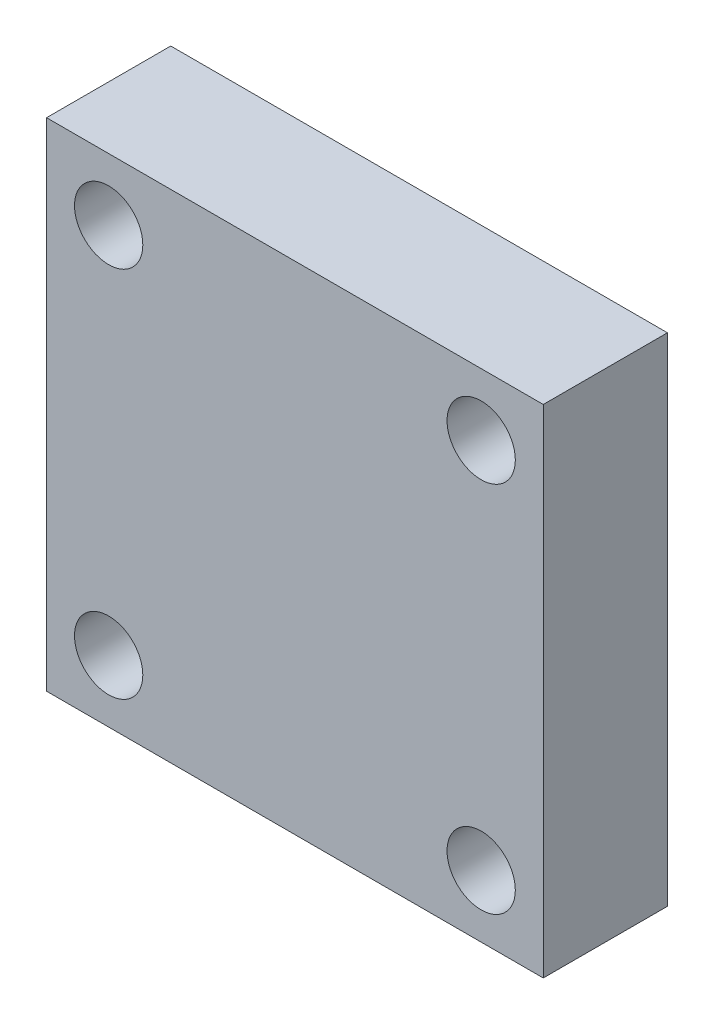
ISO-10303-21;
HEADER;
FILE_DESCRIPTION(('STEP AP214'),'2;1');
FILE_NAME('part.step','',(''),(''),'','','');
FILE_SCHEMA(('AUTOMOTIVE_DESIGN { 1 0 10303 214 1 1 1 1 }'));
ENDSEC;
DATA;
#1=APPLICATION_CONTEXT('core data for automotive mechanical design processes');
#2=APPLICATION_PROTOCOL_DEFINITION('international standard','automotive_design',2000,#1);
#3=PRODUCT_CONTEXT('',#1,'mechanical');
#4=PRODUCT('Part','Part','',(#3));
#5=PRODUCT_RELATED_PRODUCT_CATEGORY('part','',(#4));
#6=PRODUCT_DEFINITION_FORMATION('','',#4);
#7=PRODUCT_DEFINITION_CONTEXT('part definition',#1,'design');
#8=PRODUCT_DEFINITION('design','',#6,#7);
#9=PRODUCT_DEFINITION_SHAPE('','',#8);
#10=(LENGTH_UNIT() NAMED_UNIT(*) SI_UNIT(.MILLI.,.METRE.));
#11=(NAMED_UNIT(*) PLANE_ANGLE_UNIT() SI_UNIT($,.RADIAN.));
#12=(NAMED_UNIT(*) SI_UNIT($,.STERADIAN.) SOLID_ANGLE_UNIT());
#13=UNCERTAINTY_MEASURE_WITH_UNIT(LENGTH_MEASURE(1.E-05),#10,'distance_accuracy_value','');
#14=(GEOMETRIC_REPRESENTATION_CONTEXT(3) GLOBAL_UNCERTAINTY_ASSIGNED_CONTEXT((#13)) GLOBAL_UNIT_ASSIGNED_CONTEXT((#10,
#11,#12)) REPRESENTATION_CONTEXT('',''));
#15=CARTESIAN_POINT('',(0.,0.,0.));
#16=DIRECTION('',(0.,0.,1.));
#17=DIRECTION('',(1.,0.,0.));
#18=AXIS2_PLACEMENT_3D('',#15,#16,#17);
#19=CARTESIAN_POINT('',(0.,0.,10.));
#20=DIRECTION('',(0.,0.,-1.));
#21=DIRECTION('',(-1.,0.,0.));
#22=AXIS2_PLACEMENT_3D('',#19,#20,#21);
#23=PLANE('',#22);
#24=DIRECTION('',(0.,1.,0.));
#25=VECTOR('',#24,1.);
#26=CARTESIAN_POINT('',(20.,-20.,10.));
#27=LINE('',#26,#25);
#28=CARTESIAN_POINT('',(20.,-20.,10.));
#29=VERTEX_POINT('',#28);
#30=CARTESIAN_POINT('',(20.,20.,10.));
#31=VERTEX_POINT('',#30);
#32=EDGE_CURVE('E98',#29,#31,#27,.T.);
#33=ORIENTED_EDGE('',*,*,#32,.T.);
#34=DIRECTION('',(-1.,0.,0.));
#35=VECTOR('',#34,1.);
#36=CARTESIAN_POINT('',(-20.,20.,10.));
#37=LINE('',#36,#35);
#38=CARTESIAN_POINT('',(-20.,20.,10.));
#39=VERTEX_POINT('',#38);
#40=EDGE_CURVE('E93',#31,#39,#37,.T.);
#41=ORIENTED_EDGE('',*,*,#40,.T.);
#42=DIRECTION('',(0.,-1.,0.));
#43=VECTOR('',#42,1.);
#44=CARTESIAN_POINT('',(-20.,-20.,10.));
#45=LINE('',#44,#43);
#46=CARTESIAN_POINT('',(-20.,-20.,10.));
#47=VERTEX_POINT('',#46);
#48=EDGE_CURVE('E96',#39,#47,#45,.T.);
#49=ORIENTED_EDGE('',*,*,#48,.T.);
#50=DIRECTION('',(1.,0.,0.));
#51=VECTOR('',#50,1.);
#52=CARTESIAN_POINT('',(-20.,-20.,10.));
#53=LINE('',#52,#51);
#54=EDGE_CURVE('E63',#47,#29,#53,.T.);
#55=ORIENTED_EDGE('',*,*,#54,.T.);
#56=EDGE_LOOP('',(#33,#41,#49,#55));
#57=FACE_BOUND('',#56,.T.);
#58=CARTESIAN_POINT('',(-15.,-15.,10.));
#59=DIRECTION('',(0.,0.,1.));
#60=DIRECTION('',(1.,0.,0.));
#61=AXIS2_PLACEMENT_3D('',#58,#59,#60);
#62=CIRCLE('',#61,2.75);
#63=CARTESIAN_POINT('',(-12.25,-15.,10.));
#64=VERTEX_POINT('',#63);
#65=EDGE_CURVE('E118',#64,#64,#62,.T.);
#66=ORIENTED_EDGE('',*,*,#65,.F.);
#67=EDGE_LOOP('',(#66));
#68=FACE_BOUND('',#67,.T.);
#69=CARTESIAN_POINT('',(15.,-15.,10.));
#70=DIRECTION('',(0.,0.,1.));
#71=DIRECTION('',(1.,0.,0.));
#72=AXIS2_PLACEMENT_3D('',#69,#70,#71);
#73=CIRCLE('',#72,2.75);
#74=CARTESIAN_POINT('',(17.75,-15.,10.));
#75=VERTEX_POINT('',#74);
#76=EDGE_CURVE('E140',#75,#75,#73,.T.);
#77=ORIENTED_EDGE('',*,*,#76,.F.);
#78=EDGE_LOOP('',(#77));
#79=FACE_BOUND('',#78,.T.);
#80=CARTESIAN_POINT('',(15.,15.,10.));
#81=DIRECTION('',(0.,0.,1.));
#82=DIRECTION('',(1.,0.,0.));
#83=AXIS2_PLACEMENT_3D('',#80,#81,#82);
#84=CIRCLE('',#83,2.75);
#85=CARTESIAN_POINT('',(17.75,15.,10.));
#86=VERTEX_POINT('',#85);
#87=EDGE_CURVE('E148',#86,#86,#84,.T.);
#88=ORIENTED_EDGE('',*,*,#87,.F.);
#89=EDGE_LOOP('',(#88));
#90=FACE_BOUND('',#89,.T.);
#91=CARTESIAN_POINT('',(-15.,15.,10.));
#92=DIRECTION('',(0.,0.,1.));
#93=DIRECTION('',(1.,0.,0.));
#94=AXIS2_PLACEMENT_3D('',#91,#92,#93);
#95=CIRCLE('',#94,2.75);
#96=CARTESIAN_POINT('',(-12.25,15.,10.));
#97=VERTEX_POINT('',#96);
#98=EDGE_CURVE('E156',#97,#97,#95,.T.);
#99=ORIENTED_EDGE('',*,*,#98,.F.);
#100=EDGE_LOOP('',(#99));
#101=FACE_BOUND('',#100,.T.);
#102=ADVANCED_FACE('F45',(#57,#68,#79,#90,#101),#23,.F.);
#103=CARTESIAN_POINT('',(0.,0.,0.));
#104=DIRECTION('',(0.,0.,-1.));
#105=DIRECTION('',(-1.,0.,0.));
#106=AXIS2_PLACEMENT_3D('',#103,#104,#105);
#107=PLANE('',#106);
#108=CARTESIAN_POINT('',(15.,15.,0.));
#109=DIRECTION('',(0.,0.,1.));
#110=DIRECTION('',(1.,0.,0.));
#111=AXIS2_PLACEMENT_3D('',#108,#109,#110);
#112=CIRCLE('',#111,2.75);
#113=CARTESIAN_POINT('',(17.75,15.,0.));
#114=VERTEX_POINT('',#113);
#115=EDGE_CURVE('E152',#114,#114,#112,.T.);
#116=ORIENTED_EDGE('',*,*,#115,.T.);
#117=EDGE_LOOP('',(#116));
#118=FACE_BOUND('',#117,.T.);
#119=CARTESIAN_POINT('',(-15.,-15.,0.));
#120=DIRECTION('',(0.,0.,1.));
#121=DIRECTION('',(1.,0.,0.));
#122=AXIS2_PLACEMENT_3D('',#119,#120,#121);
#123=CIRCLE('',#122,2.75);
#124=CARTESIAN_POINT('',(-12.25,-15.,0.));
#125=VERTEX_POINT('',#124);
#126=EDGE_CURVE('E136',#125,#125,#123,.T.);
#127=ORIENTED_EDGE('',*,*,#126,.T.);
#128=EDGE_LOOP('',(#127));
#129=FACE_BOUND('',#128,.T.);
#130=DIRECTION('',(0.,1.,0.));
#131=VECTOR('',#130,1.);
#132=CARTESIAN_POINT('',(20.,-20.,0.));
#133=LINE('',#132,#131);
#134=CARTESIAN_POINT('',(20.,-20.,0.));
#135=VERTEX_POINT('',#134);
#136=CARTESIAN_POINT('',(20.,20.,0.));
#137=VERTEX_POINT('',#136);
#138=EDGE_CURVE('E114',#135,#137,#133,.T.);
#139=ORIENTED_EDGE('',*,*,#138,.F.);
#140=DIRECTION('',(1.,0.,0.));
#141=VECTOR('',#140,1.);
#142=CARTESIAN_POINT('',(-20.,-20.,0.));
#143=LINE('',#142,#141);
#144=CARTESIAN_POINT('',(-20.,-20.,0.));
#145=VERTEX_POINT('',#144);
#146=EDGE_CURVE('E86',#145,#135,#143,.T.);
#147=ORIENTED_EDGE('',*,*,#146,.F.);
#148=DIRECTION('',(0.,-1.,0.));
#149=VECTOR('',#148,1.);
#150=CARTESIAN_POINT('',(-20.,-20.,0.));
#151=LINE('',#150,#149);
#152=CARTESIAN_POINT('',(-20.,20.,0.));
#153=VERTEX_POINT('',#152);
#154=EDGE_CURVE('E80',#153,#145,#151,.T.);
#155=ORIENTED_EDGE('',*,*,#154,.F.);
#156=DIRECTION('',(-1.,0.,0.));
#157=VECTOR('',#156,1.);
#158=CARTESIAN_POINT('',(-20.,20.,0.));
#159=LINE('',#158,#157);
#160=EDGE_CURVE('E103',#137,#153,#159,.T.);
#161=ORIENTED_EDGE('',*,*,#160,.F.);
#162=EDGE_LOOP('',(#139,#147,#155,#161));
#163=FACE_BOUND('',#162,.T.);
#164=CARTESIAN_POINT('',(15.,-15.,0.));
#165=DIRECTION('',(0.,0.,1.));
#166=DIRECTION('',(1.,0.,0.));
#167=AXIS2_PLACEMENT_3D('',#164,#165,#166);
#168=CIRCLE('',#167,2.75);
#169=CARTESIAN_POINT('',(17.75,-15.,0.));
#170=VERTEX_POINT('',#169);
#171=EDGE_CURVE('E144',#170,#170,#168,.T.);
#172=ORIENTED_EDGE('',*,*,#171,.T.);
#173=EDGE_LOOP('',(#172));
#174=FACE_BOUND('',#173,.T.);
#175=CARTESIAN_POINT('',(-15.,15.,0.));
#176=DIRECTION('',(0.,0.,1.));
#177=DIRECTION('',(1.,0.,0.));
#178=AXIS2_PLACEMENT_3D('',#175,#176,#177);
#179=CIRCLE('',#178,2.75);
#180=CARTESIAN_POINT('',(-12.25,15.,0.));
#181=VERTEX_POINT('',#180);
#182=EDGE_CURVE('E160',#181,#181,#179,.T.);
#183=ORIENTED_EDGE('',*,*,#182,.T.);
#184=EDGE_LOOP('',(#183));
#185=FACE_BOUND('',#184,.T.);
#186=ADVANCED_FACE('F131',(#118,#129,#163,#174,#185),#107,.T.);
#187=CARTESIAN_POINT('',(20.,-20.,10.));
#188=DIRECTION('',(-1.,0.,0.));
#189=DIRECTION('',(0.,0.,1.));
#190=AXIS2_PLACEMENT_3D('',#187,#188,#189);
#191=PLANE('',#190);
#192=ORIENTED_EDGE('',*,*,#138,.T.);
#193=DIRECTION('',(0.,0.,-1.));
#194=VECTOR('',#193,1.);
#195=CARTESIAN_POINT('',(20.,20.,10.));
#196=LINE('',#195,#194);
#197=EDGE_CURVE('E11',#31,#137,#196,.T.);
#198=ORIENTED_EDGE('',*,*,#197,.F.);
#199=ORIENTED_EDGE('',*,*,#32,.F.);
#200=DIRECTION('',(0.,0.,-1.));
#201=VECTOR('',#200,1.);
#202=CARTESIAN_POINT('',(20.,-20.,10.));
#203=LINE('',#202,#201);
#204=EDGE_CURVE('E110',#29,#135,#203,.T.);
#205=ORIENTED_EDGE('',*,*,#204,.T.);
#206=EDGE_LOOP('',(#192,#198,#199,#205));
#207=FACE_BOUND('',#206,.T.);
#208=ADVANCED_FACE('F47',(#207),#191,.F.);
#209=CARTESIAN_POINT('',(-20.,20.,10.));
#210=DIRECTION('',(0.,-1.,0.));
#211=DIRECTION('',(0.,0.,-1.));
#212=AXIS2_PLACEMENT_3D('',#209,#210,#211);
#213=PLANE('',#212);
#214=ORIENTED_EDGE('',*,*,#160,.T.);
#215=DIRECTION('',(0.,0.,-1.));
#216=VECTOR('',#215,1.);
#217=CARTESIAN_POINT('',(-20.,20.,10.));
#218=LINE('',#217,#216);
#219=EDGE_CURVE('E55',#39,#153,#218,.T.);
#220=ORIENTED_EDGE('',*,*,#219,.F.);
#221=ORIENTED_EDGE('',*,*,#40,.F.);
#222=ORIENTED_EDGE('',*,*,#197,.T.);
#223=EDGE_LOOP('',(#214,#220,#221,#222));
#224=FACE_BOUND('',#223,.T.);
#225=ADVANCED_FACE('F102',(#224),#213,.F.);
#226=CARTESIAN_POINT('',(-20.,-20.,10.));
#227=DIRECTION('',(1.,0.,0.));
#228=DIRECTION('',(0.,0.,-1.));
#229=AXIS2_PLACEMENT_3D('',#226,#227,#228);
#230=PLANE('',#229);
#231=ORIENTED_EDGE('',*,*,#154,.T.);
#232=DIRECTION('',(0.,0.,-1.));
#233=VECTOR('',#232,1.);
#234=CARTESIAN_POINT('',(-20.,-20.,10.));
#235=LINE('',#234,#233);
#236=EDGE_CURVE('E105',#47,#145,#235,.T.);
#237=ORIENTED_EDGE('',*,*,#236,.F.);
#238=ORIENTED_EDGE('',*,*,#48,.F.);
#239=ORIENTED_EDGE('',*,*,#219,.T.);
#240=EDGE_LOOP('',(#231,#237,#238,#239));
#241=FACE_BOUND('',#240,.T.);
#242=ADVANCED_FACE('F106',(#241),#230,.F.);
#243=CARTESIAN_POINT('',(-20.,-20.,10.));
#244=DIRECTION('',(0.,1.,0.));
#245=DIRECTION('',(0.,0.,1.));
#246=AXIS2_PLACEMENT_3D('',#243,#244,#245);
#247=PLANE('',#246);
#248=ORIENTED_EDGE('',*,*,#146,.T.);
#249=ORIENTED_EDGE('',*,*,#204,.F.);
#250=ORIENTED_EDGE('',*,*,#54,.F.);
#251=ORIENTED_EDGE('',*,*,#236,.T.);
#252=EDGE_LOOP('',(#248,#249,#250,#251));
#253=FACE_BOUND('',#252,.T.);
#254=ADVANCED_FACE('F128',(#253),#247,.F.);
#255=CARTESIAN_POINT('',(-15.,-15.,10.));
#256=DIRECTION('',(0.,0.,-1.));
#257=DIRECTION('',(-1.,0.,0.));
#258=AXIS2_PLACEMENT_3D('',#255,#256,#257);
#259=CYLINDRICAL_SURFACE('',#258,2.75);
#260=ORIENTED_EDGE('',*,*,#65,.T.);
#261=EDGE_LOOP('',(#260));
#262=FACE_BOUND('',#261,.T.);
#263=ORIENTED_EDGE('',*,*,#126,.F.);
#264=EDGE_LOOP('',(#263));
#265=FACE_BOUND('',#264,.T.);
#266=ADVANCED_FACE('F179',(#262,#265),#259,.F.);
#267=CARTESIAN_POINT('',(15.,-15.,10.));
#268=DIRECTION('',(0.,0.,-1.));
#269=DIRECTION('',(-1.,0.,0.));
#270=AXIS2_PLACEMENT_3D('',#267,#268,#269);
#271=CYLINDRICAL_SURFACE('',#270,2.75);
#272=ORIENTED_EDGE('',*,*,#76,.T.);
#273=EDGE_LOOP('',(#272));
#274=FACE_BOUND('',#273,.T.);
#275=ORIENTED_EDGE('',*,*,#171,.F.);
#276=EDGE_LOOP('',(#275));
#277=FACE_BOUND('',#276,.T.);
#278=ADVANCED_FACE('F224',(#274,#277),#271,.F.);
#279=CARTESIAN_POINT('',(15.,15.,10.));
#280=DIRECTION('',(0.,0.,-1.));
#281=DIRECTION('',(-1.,0.,0.));
#282=AXIS2_PLACEMENT_3D('',#279,#280,#281);
#283=CYLINDRICAL_SURFACE('',#282,2.75);
#284=ORIENTED_EDGE('',*,*,#87,.T.);
#285=EDGE_LOOP('',(#284));
#286=FACE_BOUND('',#285,.T.);
#287=ORIENTED_EDGE('',*,*,#115,.F.);
#288=EDGE_LOOP('',(#287));
#289=FACE_BOUND('',#288,.T.);
#290=ADVANCED_FACE('F232',(#286,#289),#283,.F.);
#291=CARTESIAN_POINT('',(-15.,15.,10.));
#292=DIRECTION('',(0.,0.,-1.));
#293=DIRECTION('',(-1.,0.,0.));
#294=AXIS2_PLACEMENT_3D('',#291,#292,#293);
#295=CYLINDRICAL_SURFACE('',#294,2.75);
#296=ORIENTED_EDGE('',*,*,#98,.T.);
#297=EDGE_LOOP('',(#296));
#298=FACE_BOUND('',#297,.T.);
#299=ORIENTED_EDGE('',*,*,#182,.F.);
#300=EDGE_LOOP('',(#299));
#301=FACE_BOUND('',#300,.T.);
#302=ADVANCED_FACE('F168',(#298,#301),#295,.F.);
#303=CLOSED_SHELL('',(#102,#186,#208,#225,#242,#254,#266,#278,#290,#302));
#304=MANIFOLD_SOLID_BREP('B2',#303);
#305=ADVANCED_BREP_SHAPE_REPRESENTATION('',(#18,#304),#14);
#306=SHAPE_DEFINITION_REPRESENTATION(#9,#305);
ENDSEC;
END-ISO-10303-21;
